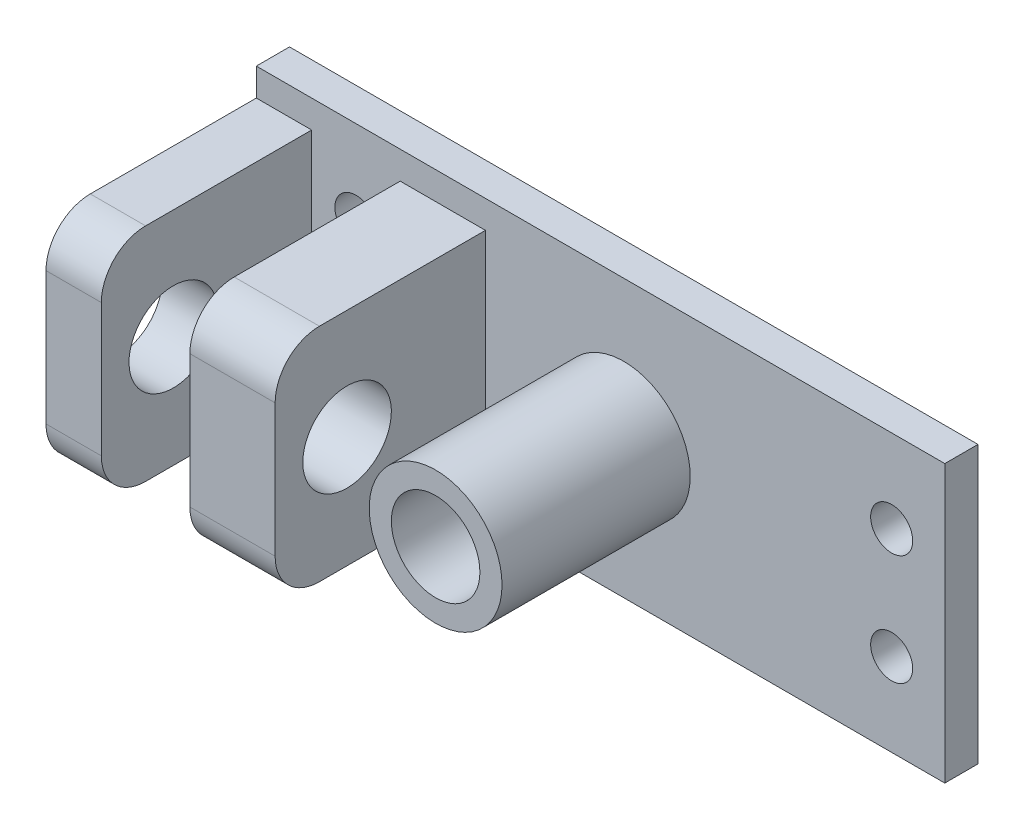
ISO-10303-21;
HEADER;
FILE_DESCRIPTION(('STEP AP214'),'2;1');
FILE_NAME('part.step','',(''),(''),'','','');
FILE_SCHEMA(('AUTOMOTIVE_DESIGN { 1 0 10303 214 1 1 1 1 }'));
ENDSEC;
DATA;
#1=APPLICATION_CONTEXT('core data for automotive mechanical design processes');
#2=APPLICATION_PROTOCOL_DEFINITION('international standard','automotive_design',2000,#1);
#3=PRODUCT_CONTEXT('',#1,'mechanical');
#4=PRODUCT('Part','Part','',(#3));
#5=PRODUCT_RELATED_PRODUCT_CATEGORY('part','',(#4));
#6=PRODUCT_DEFINITION_FORMATION('','',#4);
#7=PRODUCT_DEFINITION_CONTEXT('part definition',#1,'design');
#8=PRODUCT_DEFINITION('design','',#6,#7);
#9=PRODUCT_DEFINITION_SHAPE('','',#8);
#10=(LENGTH_UNIT() NAMED_UNIT(*) SI_UNIT(.MILLI.,.METRE.));
#11=(NAMED_UNIT(*) PLANE_ANGLE_UNIT() SI_UNIT($,.RADIAN.));
#12=(NAMED_UNIT(*) SI_UNIT($,.STERADIAN.) SOLID_ANGLE_UNIT());
#13=UNCERTAINTY_MEASURE_WITH_UNIT(LENGTH_MEASURE(1.E-05),#10,'distance_accuracy_value','');
#14=(GEOMETRIC_REPRESENTATION_CONTEXT(3) GLOBAL_UNCERTAINTY_ASSIGNED_CONTEXT((#13)) GLOBAL_UNIT_ASSIGNED_CONTEXT((#10,
#11,#12)) REPRESENTATION_CONTEXT('',''));
#15=CARTESIAN_POINT('',(0.,0.,0.));
#16=DIRECTION('',(0.,0.,1.));
#17=DIRECTION('',(1.,0.,0.));
#18=AXIS2_PLACEMENT_3D('',#15,#16,#17);
#19=CARTESIAN_POINT('',(0.,0.,3.));
#20=DIRECTION('',(0.,0.,1.));
#21=DIRECTION('',(1.,0.,0.));
#22=AXIS2_PLACEMENT_3D('',#19,#20,#21);
#23=PLANE('',#22);
#24=CARTESIAN_POINT('',(0.,0.,3.));
#25=DIRECTION('',(0.,0.,1.));
#26=DIRECTION('',(1.,0.,0.));
#27=AXIS2_PLACEMENT_3D('',#24,#25,#26);
#28=CIRCLE('',#27,6.);
#29=CARTESIAN_POINT('',(6.,0.,3.));
#30=VERTEX_POINT('',#29);
#31=EDGE_CURVE('E269',#30,#30,#28,.F.);
#32=ORIENTED_EDGE('',*,*,#31,.T.);
#33=EDGE_LOOP('',(#32));
#34=FACE_BOUND('',#33,.T.);
#35=CARTESIAN_POINT('',(-24.2,5.,3.));
#36=DIRECTION('',(0.,0.,1.));
#37=DIRECTION('',(1.,0.,0.));
#38=AXIS2_PLACEMENT_3D('',#35,#36,#37);
#39=CIRCLE('',#38,1.9);
#40=CARTESIAN_POINT('',(-22.3,5.,3.));
#41=VERTEX_POINT('',#40);
#42=EDGE_CURVE('E282',#41,#41,#39,.T.);
#43=ORIENTED_EDGE('',*,*,#42,.F.);
#44=EDGE_LOOP('',(#43));
#45=FACE_BOUND('',#44,.T.);
#46=CARTESIAN_POINT('',(24.2,5.,3.));
#47=DIRECTION('',(0.,0.,1.));
#48=DIRECTION('',(1.,0.,0.));
#49=AXIS2_PLACEMENT_3D('',#46,#47,#48);
#50=CIRCLE('',#49,1.9);
#51=CARTESIAN_POINT('',(26.1,5.,3.));
#52=VERTEX_POINT('',#51);
#53=EDGE_CURVE('E298',#52,#52,#50,.T.);
#54=ORIENTED_EDGE('',*,*,#53,.F.);
#55=EDGE_LOOP('',(#54));
#56=FACE_BOUND('',#55,.T.);
#57=CARTESIAN_POINT('',(24.2,-5.,3.));
#58=DIRECTION('',(0.,0.,1.));
#59=DIRECTION('',(1.,0.,0.));
#60=AXIS2_PLACEMENT_3D('',#57,#58,#59);
#61=CIRCLE('',#60,1.9);
#62=CARTESIAN_POINT('',(26.1,-5.,3.));
#63=VERTEX_POINT('',#62);
#64=EDGE_CURVE('E290',#63,#63,#61,.T.);
#65=ORIENTED_EDGE('',*,*,#64,.F.);
#66=EDGE_LOOP('',(#65));
#67=FACE_BOUND('',#66,.T.);
#68=CARTESIAN_POINT('',(-24.2,-5.,3.));
#69=DIRECTION('',(0.,0.,1.));
#70=DIRECTION('',(1.,0.,0.));
#71=AXIS2_PLACEMENT_3D('',#68,#69,#70);
#72=CIRCLE('',#71,1.9);
#73=CARTESIAN_POINT('',(-22.3,-5.,3.));
#74=VERTEX_POINT('',#73);
#75=EDGE_CURVE('E274',#74,#74,#72,.T.);
#76=ORIENTED_EDGE('',*,*,#75,.F.);
#77=EDGE_LOOP('',(#76));
#78=FACE_BOUND('',#77,.T.);
#79=DIRECTION('',(-1.,0.,0.));
#80=VECTOR('',#79,1.);
#81=CARTESIAN_POINT('',(-20.2,9.9981412265895,3.));
#82=LINE('',#81,#80);
#83=CARTESIAN_POINT('',(-12.5,9.9981412265895,3.));
#84=VERTEX_POINT('',#83);
#85=CARTESIAN_POINT('',(-20.2,9.9981412265895,3.));
#86=VERTEX_POINT('',#85);
#87=EDGE_CURVE('E235',#84,#86,#82,.T.);
#88=ORIENTED_EDGE('',*,*,#87,.F.);
#89=DIRECTION('',(0.,1.,0.));
#90=VECTOR('',#89,1.);
#91=CARTESIAN_POINT('',(-12.5,9.9981412265895,3.));
#92=LINE('',#91,#90);
#93=CARTESIAN_POINT('',(-12.5,-9.9981412265895,3.));
#94=VERTEX_POINT('',#93);
#95=EDGE_CURVE('E221',#94,#84,#92,.T.);
#96=ORIENTED_EDGE('',*,*,#95,.F.);
#97=DIRECTION('',(1.,0.,0.));
#98=VECTOR('',#97,1.);
#99=CARTESIAN_POINT('',(-20.2,-9.9981412265895,3.));
#100=LINE('',#99,#98);
#101=CARTESIAN_POINT('',(-20.2,-9.9981412265895,3.));
#102=VERTEX_POINT('',#101);
#103=EDGE_CURVE('E227',#102,#94,#100,.T.);
#104=ORIENTED_EDGE('',*,*,#103,.F.);
#105=DIRECTION('',(0.,-1.,0.));
#106=VECTOR('',#105,1.);
#107=CARTESIAN_POINT('',(-20.2,9.9981412265895,3.));
#108=LINE('',#107,#106);
#109=EDGE_CURVE('E239',#86,#102,#108,.T.);
#110=ORIENTED_EDGE('',*,*,#109,.F.);
#111=EDGE_LOOP('',(#88,#96,#104,#110));
#112=FACE_BOUND('',#111,.T.);
#113=DIRECTION('',(0.,-1.,0.));
#114=VECTOR('',#113,1.);
#115=CARTESIAN_POINT('',(-33.2,12.5,3.));
#116=LINE('',#115,#114);
#117=CARTESIAN_POINT('',(-33.2,12.5,3.));
#118=VERTEX_POINT('',#117);
#119=CARTESIAN_POINT('',(-33.2,9.9981412265895,3.));
#120=VERTEX_POINT('',#119);
#121=EDGE_CURVE('E176',#118,#120,#116,.T.);
#122=ORIENTED_EDGE('',*,*,#121,.T.);
#123=DIRECTION('',(-1.,0.,0.));
#124=VECTOR('',#123,1.);
#125=CARTESIAN_POINT('',(-28.2,9.9981412265895,3.));
#126=LINE('',#125,#124);
#127=CARTESIAN_POINT('',(-28.2,9.9981412265895,3.));
#128=VERTEX_POINT('',#127);
#129=EDGE_CURVE('E186',#128,#120,#126,.T.);
#130=ORIENTED_EDGE('',*,*,#129,.F.);
#131=DIRECTION('',(0.,1.,0.));
#132=VECTOR('',#131,1.);
#133=CARTESIAN_POINT('',(-28.2,9.9981412265895,3.));
#134=LINE('',#133,#132);
#135=CARTESIAN_POINT('',(-28.2,-9.9981412265895,3.));
#136=VERTEX_POINT('',#135);
#137=EDGE_CURVE('E183',#136,#128,#134,.T.);
#138=ORIENTED_EDGE('',*,*,#137,.F.);
#139=DIRECTION('',(1.,0.,0.));
#140=VECTOR('',#139,1.);
#141=CARTESIAN_POINT('',(-28.2,-9.9981412265895,3.));
#142=LINE('',#141,#140);
#143=CARTESIAN_POINT('',(-33.2,-9.9981412265895,3.));
#144=VERTEX_POINT('',#143);
#145=EDGE_CURVE('E161',#144,#136,#142,.T.);
#146=ORIENTED_EDGE('',*,*,#145,.F.);
#147=CARTESIAN_POINT('',(-33.2,-12.5,3.));
#148=VERTEX_POINT('',#147);
#149=EDGE_CURVE('E168',#144,#148,#116,.T.);
#150=ORIENTED_EDGE('',*,*,#149,.T.);
#151=DIRECTION('',(1.,0.,0.));
#152=VECTOR('',#151,1.);
#153=CARTESIAN_POINT('',(-29.,-12.5,3.));
#154=LINE('',#153,#152);
#155=CARTESIAN_POINT('',(29.,-12.5,3.));
#156=VERTEX_POINT('',#155);
#157=EDGE_CURVE('E314',#148,#156,#154,.T.);
#158=ORIENTED_EDGE('',*,*,#157,.T.);
#159=DIRECTION('',(0.,1.,0.));
#160=VECTOR('',#159,1.);
#161=CARTESIAN_POINT('',(29.,12.5,3.));
#162=LINE('',#161,#160);
#163=CARTESIAN_POINT('',(29.,12.5,3.));
#164=VERTEX_POINT('',#163);
#165=EDGE_CURVE('E306',#156,#164,#162,.T.);
#166=ORIENTED_EDGE('',*,*,#165,.T.);
#167=DIRECTION('',(-1.,0.,0.));
#168=VECTOR('',#167,1.);
#169=CARTESIAN_POINT('',(-29.,12.5,3.));
#170=LINE('',#169,#168);
#171=EDGE_CURVE('E310',#164,#118,#170,.T.);
#172=ORIENTED_EDGE('',*,*,#171,.T.);
#173=EDGE_LOOP('',(#122,#130,#138,#146,#150,#158,#166,#172));
#174=FACE_BOUND('',#173,.T.);
#175=ADVANCED_FACE('F45',(#34,#45,#56,#67,#78,#112,#174),#23,.T.);
#176=CARTESIAN_POINT('',(0.,0.,0.));
#177=DIRECTION('',(0.,0.,1.));
#178=DIRECTION('',(1.,0.,0.));
#179=AXIS2_PLACEMENT_3D('',#176,#177,#178);
#180=PLANE('',#179);
#181=CARTESIAN_POINT('',(0.,0.,0.));
#182=DIRECTION('',(0.,0.,1.));
#183=DIRECTION('',(1.,0.,0.));
#184=AXIS2_PLACEMENT_3D('',#181,#182,#183);
#185=CIRCLE('',#184,4.);
#186=CARTESIAN_POINT('',(4.,0.,0.));
#187=VERTEX_POINT('',#186);
#188=EDGE_CURVE('E258',#187,#187,#185,.T.);
#189=ORIENTED_EDGE('',*,*,#188,.T.);
#190=EDGE_LOOP('',(#189));
#191=FACE_BOUND('',#190,.T.);
#192=DIRECTION('',(0.,1.,0.));
#193=VECTOR('',#192,1.);
#194=CARTESIAN_POINT('',(29.,12.5,0.));
#195=LINE('',#194,#193);
#196=CARTESIAN_POINT('',(29.,-12.5,0.));
#197=VERTEX_POINT('',#196);
#198=CARTESIAN_POINT('',(29.,12.5,0.));
#199=VERTEX_POINT('',#198);
#200=EDGE_CURVE('E302',#197,#199,#195,.T.);
#201=ORIENTED_EDGE('',*,*,#200,.F.);
#202=DIRECTION('',(1.,0.,0.));
#203=VECTOR('',#202,1.);
#204=CARTESIAN_POINT('',(-29.,-12.5,0.));
#205=LINE('',#204,#203);
#206=CARTESIAN_POINT('',(-33.2,-12.5,0.));
#207=VERTEX_POINT('',#206);
#208=EDGE_CURVE('E311',#207,#197,#205,.T.);
#209=ORIENTED_EDGE('',*,*,#208,.F.);
#210=DIRECTION('',(0.,-1.,0.));
#211=VECTOR('',#210,1.);
#212=CARTESIAN_POINT('',(-33.2,12.5,0.));
#213=LINE('',#212,#211);
#214=CARTESIAN_POINT('',(-33.2,12.5,0.));
#215=VERTEX_POINT('',#214);
#216=EDGE_CURVE('E203',#215,#207,#213,.T.);
#217=ORIENTED_EDGE('',*,*,#216,.F.);
#218=DIRECTION('',(-1.,0.,0.));
#219=VECTOR('',#218,1.);
#220=CARTESIAN_POINT('',(-29.,12.5,0.));
#221=LINE('',#220,#219);
#222=EDGE_CURVE('E321',#199,#215,#221,.T.);
#223=ORIENTED_EDGE('',*,*,#222,.F.);
#224=EDGE_LOOP('',(#201,#209,#217,#223));
#225=FACE_BOUND('',#224,.T.);
#226=CARTESIAN_POINT('',(24.2,5.,0.));
#227=DIRECTION('',(0.,0.,1.));
#228=DIRECTION('',(1.,0.,0.));
#229=AXIS2_PLACEMENT_3D('',#226,#227,#228);
#230=CIRCLE('',#229,1.9);
#231=CARTESIAN_POINT('',(26.1,5.,0.));
#232=VERTEX_POINT('',#231);
#233=EDGE_CURVE('E294',#232,#232,#230,.T.);
#234=ORIENTED_EDGE('',*,*,#233,.T.);
#235=EDGE_LOOP('',(#234));
#236=FACE_BOUND('',#235,.T.);
#237=CARTESIAN_POINT('',(24.2,-5.,0.));
#238=DIRECTION('',(0.,0.,1.));
#239=DIRECTION('',(1.,0.,0.));
#240=AXIS2_PLACEMENT_3D('',#237,#238,#239);
#241=CIRCLE('',#240,1.9);
#242=CARTESIAN_POINT('',(26.1,-5.,0.));
#243=VERTEX_POINT('',#242);
#244=EDGE_CURVE('E286',#243,#243,#241,.T.);
#245=ORIENTED_EDGE('',*,*,#244,.T.);
#246=EDGE_LOOP('',(#245));
#247=FACE_BOUND('',#246,.T.);
#248=CARTESIAN_POINT('',(-24.2,5.,0.));
#249=DIRECTION('',(0.,0.,1.));
#250=DIRECTION('',(1.,0.,0.));
#251=AXIS2_PLACEMENT_3D('',#248,#249,#250);
#252=CIRCLE('',#251,1.9);
#253=CARTESIAN_POINT('',(-22.3,5.,0.));
#254=VERTEX_POINT('',#253);
#255=EDGE_CURVE('E278',#254,#254,#252,.T.);
#256=ORIENTED_EDGE('',*,*,#255,.T.);
#257=EDGE_LOOP('',(#256));
#258=FACE_BOUND('',#257,.T.);
#259=CARTESIAN_POINT('',(-24.2,-5.,0.));
#260=DIRECTION('',(0.,0.,1.));
#261=DIRECTION('',(1.,0.,0.));
#262=AXIS2_PLACEMENT_3D('',#259,#260,#261);
#263=CIRCLE('',#262,1.9);
#264=CARTESIAN_POINT('',(-22.3,-5.,0.));
#265=VERTEX_POINT('',#264);
#266=EDGE_CURVE('E273',#265,#265,#263,.T.);
#267=ORIENTED_EDGE('',*,*,#266,.T.);
#268=EDGE_LOOP('',(#267));
#269=FACE_BOUND('',#268,.T.);
#270=ADVANCED_FACE('F423',(#191,#225,#236,#247,#258,#269),#180,.F.);
#271=CARTESIAN_POINT('',(29.,12.5,3.));
#272=DIRECTION('',(-1.,0.,0.));
#273=DIRECTION('',(0.,0.,1.));
#274=AXIS2_PLACEMENT_3D('',#271,#272,#273);
#275=PLANE('',#274);
#276=ORIENTED_EDGE('',*,*,#200,.T.);
#277=DIRECTION('',(0.,0.,-1.));
#278=VECTOR('',#277,1.);
#279=CARTESIAN_POINT('',(29.,12.5,3.));
#280=LINE('',#279,#278);
#281=EDGE_CURVE('E329',#164,#199,#280,.T.);
#282=ORIENTED_EDGE('',*,*,#281,.F.);
#283=ORIENTED_EDGE('',*,*,#165,.F.);
#284=DIRECTION('',(0.,0.,-1.));
#285=VECTOR('',#284,1.);
#286=CARTESIAN_POINT('',(29.,-12.5,3.));
#287=LINE('',#286,#285);
#288=EDGE_CURVE('E317',#156,#197,#287,.T.);
#289=ORIENTED_EDGE('',*,*,#288,.T.);
#290=EDGE_LOOP('',(#276,#282,#283,#289));
#291=FACE_BOUND('',#290,.T.);
#292=ADVANCED_FACE('F430',(#291),#275,.F.);
#293=CARTESIAN_POINT('',(-29.,12.5,3.));
#294=DIRECTION('',(0.,-1.,0.));
#295=DIRECTION('',(0.,0.,-1.));
#296=AXIS2_PLACEMENT_3D('',#293,#294,#295);
#297=PLANE('',#296);
#298=ORIENTED_EDGE('',*,*,#222,.T.);
#299=DIRECTION('',(0.,0.,1.));
#300=VECTOR('',#299,1.);
#301=CARTESIAN_POINT('',(-33.2,12.5,0.));
#302=LINE('',#301,#300);
#303=EDGE_CURVE('E205',#215,#118,#302,.T.);
#304=ORIENTED_EDGE('',*,*,#303,.T.);
#305=ORIENTED_EDGE('',*,*,#171,.F.);
#306=ORIENTED_EDGE('',*,*,#281,.T.);
#307=EDGE_LOOP('',(#298,#304,#305,#306));
#308=FACE_BOUND('',#307,.T.);
#309=ADVANCED_FACE('F440',(#308),#297,.F.);
#310=CARTESIAN_POINT('',(-29.,-12.5,3.));
#311=DIRECTION('',(0.,1.,0.));
#312=DIRECTION('',(0.,0.,1.));
#313=AXIS2_PLACEMENT_3D('',#310,#311,#312);
#314=PLANE('',#313);
#315=ORIENTED_EDGE('',*,*,#208,.T.);
#316=ORIENTED_EDGE('',*,*,#288,.F.);
#317=ORIENTED_EDGE('',*,*,#157,.F.);
#318=DIRECTION('',(0.,0.,1.));
#319=VECTOR('',#318,1.);
#320=CARTESIAN_POINT('',(-33.2,-12.5,0.));
#321=LINE('',#320,#319);
#322=EDGE_CURVE('E172',#207,#148,#321,.T.);
#323=ORIENTED_EDGE('',*,*,#322,.F.);
#324=EDGE_LOOP('',(#315,#316,#317,#323));
#325=FACE_BOUND('',#324,.T.);
#326=ADVANCED_FACE('F438',(#325),#314,.F.);
#327=CARTESIAN_POINT('',(24.2,5.,3.));
#328=DIRECTION('',(0.,0.,-1.));
#329=DIRECTION('',(-1.,0.,0.));
#330=AXIS2_PLACEMENT_3D('',#327,#328,#329);
#331=CYLINDRICAL_SURFACE('',#330,1.9);
#332=ORIENTED_EDGE('',*,*,#53,.T.);
#333=EDGE_LOOP('',(#332));
#334=FACE_BOUND('',#333,.T.);
#335=ORIENTED_EDGE('',*,*,#233,.F.);
#336=EDGE_LOOP('',(#335));
#337=FACE_BOUND('',#336,.T.);
#338=ADVANCED_FACE('F435',(#334,#337),#331,.F.);
#339=CARTESIAN_POINT('',(24.2,-5.,3.));
#340=DIRECTION('',(0.,0.,-1.));
#341=DIRECTION('',(-1.,0.,0.));
#342=AXIS2_PLACEMENT_3D('',#339,#340,#341);
#343=CYLINDRICAL_SURFACE('',#342,1.9);
#344=ORIENTED_EDGE('',*,*,#64,.T.);
#345=EDGE_LOOP('',(#344));
#346=FACE_BOUND('',#345,.T.);
#347=ORIENTED_EDGE('',*,*,#244,.F.);
#348=EDGE_LOOP('',(#347));
#349=FACE_BOUND('',#348,.T.);
#350=ADVANCED_FACE('F624',(#346,#349),#343,.F.);
#351=CARTESIAN_POINT('',(-24.2,5.,3.));
#352=DIRECTION('',(0.,0.,-1.));
#353=DIRECTION('',(-1.,0.,0.));
#354=AXIS2_PLACEMENT_3D('',#351,#352,#353);
#355=CYLINDRICAL_SURFACE('',#354,1.9);
#356=ORIENTED_EDGE('',*,*,#42,.T.);
#357=EDGE_LOOP('',(#356));
#358=FACE_BOUND('',#357,.T.);
#359=ORIENTED_EDGE('',*,*,#255,.F.);
#360=EDGE_LOOP('',(#359));
#361=FACE_BOUND('',#360,.T.);
#362=ADVANCED_FACE('F615',(#358,#361),#355,.F.);
#363=CARTESIAN_POINT('',(-24.2,-5.,3.));
#364=DIRECTION('',(0.,0.,-1.));
#365=DIRECTION('',(-1.,0.,0.));
#366=AXIS2_PLACEMENT_3D('',#363,#364,#365);
#367=CYLINDRICAL_SURFACE('',#366,1.9);
#368=ORIENTED_EDGE('',*,*,#75,.T.);
#369=EDGE_LOOP('',(#368));
#370=FACE_BOUND('',#369,.T.);
#371=ORIENTED_EDGE('',*,*,#266,.F.);
#372=EDGE_LOOP('',(#371));
#373=FACE_BOUND('',#372,.T.);
#374=ADVANCED_FACE('F606',(#370,#373),#367,.F.);
#375=CARTESIAN_POINT('',(0.,0.,20.));
#376=DIRECTION('',(0.,0.,-1.));
#377=DIRECTION('',(-1.,0.,0.));
#378=AXIS2_PLACEMENT_3D('',#375,#376,#377);
#379=CYLINDRICAL_SURFACE('',#378,6.);
#380=ORIENTED_EDGE('',*,*,#31,.F.);
#381=EDGE_LOOP('',(#380));
#382=FACE_BOUND('',#381,.T.);
#383=CARTESIAN_POINT('',(0.,0.,20.));
#384=DIRECTION('',(0.,0.,1.));
#385=DIRECTION('',(1.,0.,0.));
#386=AXIS2_PLACEMENT_3D('',#383,#384,#385);
#387=CIRCLE('',#386,6.);
#388=CARTESIAN_POINT('',(6.,0.,20.));
#389=VERTEX_POINT('',#388);
#390=EDGE_CURVE('E262',#389,#389,#387,.T.);
#391=ORIENTED_EDGE('',*,*,#390,.F.);
#392=EDGE_LOOP('',(#391));
#393=FACE_BOUND('',#392,.T.);
#394=ADVANCED_FACE('F597',(#382,#393),#379,.T.);
#395=CARTESIAN_POINT('',(0.,0.,20.));
#396=DIRECTION('',(0.,0.,1.));
#397=DIRECTION('',(1.,0.,0.));
#398=AXIS2_PLACEMENT_3D('',#395,#396,#397);
#399=PLANE('',#398);
#400=CARTESIAN_POINT('',(0.,0.,20.));
#401=DIRECTION('',(0.,0.,1.));
#402=DIRECTION('',(1.,0.,0.));
#403=AXIS2_PLACEMENT_3D('',#400,#401,#402);
#404=CIRCLE('',#403,4.);
#405=CARTESIAN_POINT('',(4.,0.,20.));
#406=VERTEX_POINT('',#405);
#407=EDGE_CURVE('E257',#406,#406,#404,.T.);
#408=ORIENTED_EDGE('',*,*,#407,.F.);
#409=EDGE_LOOP('',(#408));
#410=FACE_BOUND('',#409,.T.);
#411=ORIENTED_EDGE('',*,*,#390,.T.);
#412=EDGE_LOOP('',(#411));
#413=FACE_BOUND('',#412,.T.);
#414=ADVANCED_FACE('F588',(#410,#413),#399,.T.);
#415=CARTESIAN_POINT('',(0.,0.,0.));
#416=DIRECTION('',(0.,0.,1.));
#417=DIRECTION('',(1.,0.,0.));
#418=AXIS2_PLACEMENT_3D('',#415,#416,#417);
#419=CYLINDRICAL_SURFACE('',#418,4.);
#420=ORIENTED_EDGE('',*,*,#188,.F.);
#421=EDGE_LOOP('',(#420));
#422=FACE_BOUND('',#421,.T.);
#423=ORIENTED_EDGE('',*,*,#407,.T.);
#424=EDGE_LOOP('',(#423));
#425=FACE_BOUND('',#424,.T.);
#426=ADVANCED_FACE('F579',(#422,#425),#419,.F.);
#427=CARTESIAN_POINT('',(-12.5,9.9981412265895,22.));
#428=DIRECTION('',(-1.,0.,0.));
#429=DIRECTION('',(0.,-1.,0.));
#430=AXIS2_PLACEMENT_3D('',#427,#428,#429);
#431=PLANE('',#430);
#432=CARTESIAN_POINT('',(-12.5,0.0808269052919655,15.5));
#433=DIRECTION('',(-1.,0.,0.));
#434=DIRECTION('',(0.,-1.,0.));
#435=AXIS2_PLACEMENT_3D('',#432,#433,#434);
#436=CIRCLE('',#435,4.);
#437=CARTESIAN_POINT('',(-12.5,-3.91917309470803,15.5));
#438=VERTEX_POINT('',#437);
#439=EDGE_CURVE('E210',#438,#438,#436,.F.);
#440=ORIENTED_EDGE('',*,*,#439,.F.);
#441=EDGE_LOOP('',(#440));
#442=FACE_BOUND('',#441,.T.);
#443=DIRECTION('',(0.,1.,0.));
#444=VECTOR('',#443,1.);
#445=CARTESIAN_POINT('',(-12.5,9.9981412265895,22.));
#446=LINE('',#445,#444);
#447=CARTESIAN_POINT('',(-12.5,-5.9981412265895,22.));
#448=VERTEX_POINT('',#447);
#449=CARTESIAN_POINT('',(-12.5,5.9981412265895,22.));
#450=VERTEX_POINT('',#449);
#451=EDGE_CURVE('E222',#448,#450,#446,.T.);
#452=ORIENTED_EDGE('',*,*,#451,.F.);
#453=CARTESIAN_POINT('',(-12.5,-5.9981412265895,18.));
#454=DIRECTION('',(-1.,0.,0.));
#455=DIRECTION('',(0.,-1.,0.));
#456=AXIS2_PLACEMENT_3D('',#453,#454,#455);
#457=CIRCLE('',#456,4.);
#458=CARTESIAN_POINT('',(-12.5,-9.9981412265895,18.));
#459=VERTEX_POINT('',#458);
#460=EDGE_CURVE('E344',#448,#459,#457,.F.);
#461=ORIENTED_EDGE('',*,*,#460,.T.);
#462=DIRECTION('',(0.,0.,-1.));
#463=VECTOR('',#462,1.);
#464=CARTESIAN_POINT('',(-12.5,-9.9981412265895,22.));
#465=LINE('',#464,#463);
#466=EDGE_CURVE('E231',#459,#94,#465,.T.);
#467=ORIENTED_EDGE('',*,*,#466,.T.);
#468=ORIENTED_EDGE('',*,*,#95,.T.);
#469=DIRECTION('',(0.,0.,-1.));
#470=VECTOR('',#469,1.);
#471=CARTESIAN_POINT('',(-12.5,9.9981412265895,22.));
#472=LINE('',#471,#470);
#473=CARTESIAN_POINT('',(-12.5,9.9981412265895,18.));
#474=VERTEX_POINT('',#473);
#475=EDGE_CURVE('E254',#474,#84,#472,.T.);
#476=ORIENTED_EDGE('',*,*,#475,.F.);
#477=CARTESIAN_POINT('',(-12.5,5.9981412265895,18.));
#478=DIRECTION('',(-1.,0.,0.));
#479=DIRECTION('',(0.,-1.,0.));
#480=AXIS2_PLACEMENT_3D('',#477,#478,#479);
#481=CIRCLE('',#480,4.);
#482=EDGE_CURVE('E341',#474,#450,#481,.F.);
#483=ORIENTED_EDGE('',*,*,#482,.T.);
#484=EDGE_LOOP('',(#452,#461,#467,#468,#476,#483));
#485=FACE_BOUND('',#484,.T.);
#486=ADVANCED_FACE('F570',(#442,#485),#431,.F.);
#487=CARTESIAN_POINT('',(-20.2,9.9981412265895,22.));
#488=DIRECTION('',(0.,-1.,0.));
#489=DIRECTION('',(0.,0.,-1.));
#490=AXIS2_PLACEMENT_3D('',#487,#488,#489);
#491=PLANE('',#490);
#492=DIRECTION('',(0.,0.,-1.));
#493=VECTOR('',#492,1.);
#494=CARTESIAN_POINT('',(-20.2,9.9981412265895,22.));
#495=LINE('',#494,#493);
#496=CARTESIAN_POINT('',(-20.2,9.9981412265895,18.));
#497=VERTEX_POINT('',#496);
#498=EDGE_CURVE('E251',#497,#86,#495,.T.);
#499=ORIENTED_EDGE('',*,*,#498,.F.);
#500=DIRECTION('',(-1.,0.,0.));
#501=VECTOR('',#500,1.);
#502=CARTESIAN_POINT('',(-12.5,9.9981412265895,18.));
#503=LINE('',#502,#501);
#504=EDGE_CURVE('E356',#497,#474,#503,.F.);
#505=ORIENTED_EDGE('',*,*,#504,.T.);
#506=ORIENTED_EDGE('',*,*,#475,.T.);
#507=ORIENTED_EDGE('',*,*,#87,.T.);
#508=EDGE_LOOP('',(#499,#505,#506,#507));
#509=FACE_BOUND('',#508,.T.);
#510=ADVANCED_FACE('F561',(#509),#491,.F.);
#511=CARTESIAN_POINT('',(-20.2,9.9981412265895,22.));
#512=DIRECTION('',(1.,0.,0.));
#513=DIRECTION('',(0.,0.,-1.));
#514=AXIS2_PLACEMENT_3D('',#511,#512,#513);
#515=PLANE('',#514);
#516=CARTESIAN_POINT('',(-20.2,0.0808269052919655,15.5));
#517=DIRECTION('',(-1.,0.,0.));
#518=DIRECTION('',(0.,0.,1.));
#519=AXIS2_PLACEMENT_3D('',#516,#517,#518);
#520=CIRCLE('',#519,4.);
#521=CARTESIAN_POINT('',(-20.2,0.0808269052919655,19.5));
#522=VERTEX_POINT('',#521);
#523=EDGE_CURVE('E217',#522,#522,#520,.T.);
#524=ORIENTED_EDGE('',*,*,#523,.F.);
#525=EDGE_LOOP('',(#524));
#526=FACE_BOUND('',#525,.T.);
#527=DIRECTION('',(0.,0.,-1.));
#528=VECTOR('',#527,1.);
#529=CARTESIAN_POINT('',(-20.2,-9.9981412265895,22.));
#530=LINE('',#529,#528);
#531=CARTESIAN_POINT('',(-20.2,-9.9981412265895,18.));
#532=VERTEX_POINT('',#531);
#533=EDGE_CURVE('E248',#532,#102,#530,.T.);
#534=ORIENTED_EDGE('',*,*,#533,.F.);
#535=CARTESIAN_POINT('',(-20.2,-5.9981412265895,18.));
#536=DIRECTION('',(1.,0.,0.));
#537=DIRECTION('',(0.,0.,-1.));
#538=AXIS2_PLACEMENT_3D('',#535,#536,#537);
#539=CIRCLE('',#538,4.);
#540=CARTESIAN_POINT('',(-20.2,-5.9981412265895,22.));
#541=VERTEX_POINT('',#540);
#542=EDGE_CURVE('E353',#532,#541,#539,.F.);
#543=ORIENTED_EDGE('',*,*,#542,.T.);
#544=DIRECTION('',(0.,-1.,0.));
#545=VECTOR('',#544,1.);
#546=CARTESIAN_POINT('',(-20.2,9.9981412265895,22.));
#547=LINE('',#546,#545);
#548=CARTESIAN_POINT('',(-20.2,5.9981412265895,22.));
#549=VERTEX_POINT('',#548);
#550=EDGE_CURVE('E226',#549,#541,#547,.T.);
#551=ORIENTED_EDGE('',*,*,#550,.F.);
#552=CARTESIAN_POINT('',(-20.2,5.9981412265895,18.));
#553=DIRECTION('',(1.,0.,0.));
#554=DIRECTION('',(0.,0.,-1.));
#555=AXIS2_PLACEMENT_3D('',#552,#553,#554);
#556=CIRCLE('',#555,4.);
#557=EDGE_CURVE('E350',#549,#497,#556,.F.);
#558=ORIENTED_EDGE('',*,*,#557,.T.);
#559=ORIENTED_EDGE('',*,*,#498,.T.);
#560=ORIENTED_EDGE('',*,*,#109,.T.);
#561=EDGE_LOOP('',(#534,#543,#551,#558,#559,#560));
#562=FACE_BOUND('',#561,.T.);
#563=ADVANCED_FACE('F552',(#526,#562),#515,.F.);
#564=CARTESIAN_POINT('',(-20.2,-9.9981412265895,22.));
#565=DIRECTION('',(0.,1.,0.));
#566=DIRECTION('',(0.,0.,1.));
#567=AXIS2_PLACEMENT_3D('',#564,#565,#566);
#568=PLANE('',#567);
#569=ORIENTED_EDGE('',*,*,#466,.F.);
#570=DIRECTION('',(1.,0.,0.));
#571=VECTOR('',#570,1.);
#572=CARTESIAN_POINT('',(-20.2,-9.9981412265895,18.));
#573=LINE('',#572,#571);
#574=EDGE_CURVE('E347',#459,#532,#573,.F.);
#575=ORIENTED_EDGE('',*,*,#574,.T.);
#576=ORIENTED_EDGE('',*,*,#533,.T.);
#577=ORIENTED_EDGE('',*,*,#103,.T.);
#578=EDGE_LOOP('',(#569,#575,#576,#577));
#579=FACE_BOUND('',#578,.T.);
#580=ADVANCED_FACE('F543',(#579),#568,.F.);
#581=CARTESIAN_POINT('',(0.,0.,22.));
#582=DIRECTION('',(0.,0.,1.));
#583=DIRECTION('',(1.,0.,0.));
#584=AXIS2_PLACEMENT_3D('',#581,#582,#583);
#585=PLANE('',#584);
#586=ORIENTED_EDGE('',*,*,#550,.T.);
#587=DIRECTION('',(1.,0.,0.));
#588=VECTOR('',#587,1.);
#589=CARTESIAN_POINT('',(-12.5,-5.9981412265895,22.));
#590=LINE('',#589,#588);
#591=EDGE_CURVE('E337',#541,#448,#590,.T.);
#592=ORIENTED_EDGE('',*,*,#591,.T.);
#593=ORIENTED_EDGE('',*,*,#451,.T.);
#594=DIRECTION('',(-1.,0.,0.));
#595=VECTOR('',#594,1.);
#596=CARTESIAN_POINT('',(-20.2,5.9981412265895,22.));
#597=LINE('',#596,#595);
#598=EDGE_CURVE('E333',#450,#549,#597,.T.);
#599=ORIENTED_EDGE('',*,*,#598,.T.);
#600=EDGE_LOOP('',(#586,#592,#593,#599));
#601=FACE_BOUND('',#600,.T.);
#602=ADVANCED_FACE('F534',(#601),#585,.T.);
#603=CARTESIAN_POINT('',(29.001,0.0808269052919655,15.5));
#604=DIRECTION('',(-1.,0.,0.));
#605=DIRECTION('',(0.,0.,1.));
#606=AXIS2_PLACEMENT_3D('',#603,#604,#605);
#607=CYLINDRICAL_SURFACE('',#606,4.);
#608=ORIENTED_EDGE('',*,*,#523,.T.);
#609=EDGE_LOOP('',(#608));
#610=FACE_BOUND('',#609,.T.);
#611=ORIENTED_EDGE('',*,*,#439,.T.);
#612=EDGE_LOOP('',(#611));
#613=FACE_BOUND('',#612,.T.);
#614=ADVANCED_FACE('F451',(#610,#613),#607,.F.);
#615=CARTESIAN_POINT('',(0.,-5.9981412265895,18.));
#616=DIRECTION('',(-1.,0.,0.));
#617=DIRECTION('',(0.,0.,1.));
#618=AXIS2_PLACEMENT_3D('',#615,#616,#617);
#619=CYLINDRICAL_SURFACE('',#618,4.);
#620=ORIENTED_EDGE('',*,*,#542,.F.);
#621=ORIENTED_EDGE('',*,*,#574,.F.);
#622=ORIENTED_EDGE('',*,*,#460,.F.);
#623=ORIENTED_EDGE('',*,*,#591,.F.);
#624=EDGE_LOOP('',(#620,#621,#622,#623));
#625=FACE_BOUND('',#624,.T.);
#626=ADVANCED_FACE('F448',(#625),#619,.T.);
#627=CARTESIAN_POINT('',(0.,5.9981412265895,18.));
#628=DIRECTION('',(1.,0.,0.));
#629=DIRECTION('',(0.,0.,-1.));
#630=AXIS2_PLACEMENT_3D('',#627,#628,#629);
#631=CYLINDRICAL_SURFACE('',#630,4.);
#632=ORIENTED_EDGE('',*,*,#482,.F.);
#633=ORIENTED_EDGE('',*,*,#504,.F.);
#634=ORIENTED_EDGE('',*,*,#557,.F.);
#635=ORIENTED_EDGE('',*,*,#598,.F.);
#636=EDGE_LOOP('',(#632,#633,#634,#635));
#637=FACE_BOUND('',#636,.T.);
#638=ADVANCED_FACE('F420',(#637),#631,.T.);
#639=CARTESIAN_POINT('',(-33.2,12.5,0.));
#640=DIRECTION('',(-1.,0.,0.));
#641=DIRECTION('',(0.,-1.,0.));
#642=AXIS2_PLACEMENT_3D('',#639,#640,#641);
#643=PLANE('',#642);
#644=CARTESIAN_POINT('',(-33.2,0.0635780718363604,15.5));
#645=DIRECTION('',(-1.,0.,0.));
#646=DIRECTION('',(0.,-1.,0.));
#647=AXIS2_PLACEMENT_3D('',#644,#645,#646);
#648=CIRCLE('',#647,4.);
#649=CARTESIAN_POINT('',(-33.2,-3.93642192816364,15.5));
#650=VERTEX_POINT('',#649);
#651=EDGE_CURVE('E399',#650,#650,#648,.F.);
#652=ORIENTED_EDGE('',*,*,#651,.T.);
#653=EDGE_LOOP('',(#652));
#654=FACE_BOUND('',#653,.T.);
#655=DIRECTION('',(0.,0.,-1.));
#656=VECTOR('',#655,1.);
#657=CARTESIAN_POINT('',(-33.2,-9.9981412265895,22.));
#658=LINE('',#657,#656);
#659=CARTESIAN_POINT('',(-33.2,-9.9981412265895,18.));
#660=VERTEX_POINT('',#659);
#661=EDGE_CURVE('E157',#660,#144,#658,.T.);
#662=ORIENTED_EDGE('',*,*,#661,.F.);
#663=CARTESIAN_POINT('',(-33.2,-5.9981412265895,18.));
#664=DIRECTION('',(-1.,0.,0.));
#665=DIRECTION('',(0.,-1.,0.));
#666=AXIS2_PLACEMENT_3D('',#663,#664,#665);
#667=CIRCLE('',#666,4.);
#668=CARTESIAN_POINT('',(-33.2,-5.9981412265895,22.));
#669=VERTEX_POINT('',#668);
#670=EDGE_CURVE('E54',#660,#669,#667,.T.);
#671=ORIENTED_EDGE('',*,*,#670,.T.);
#672=DIRECTION('',(0.,-1.,0.));
#673=VECTOR('',#672,1.);
#674=CARTESIAN_POINT('',(-33.2,9.9981412265895,22.));
#675=LINE('',#674,#673);
#676=CARTESIAN_POINT('',(-33.2,5.9981412265895,22.));
#677=VERTEX_POINT('',#676);
#678=EDGE_CURVE('E191',#677,#669,#675,.T.);
#679=ORIENTED_EDGE('',*,*,#678,.F.);
#680=CARTESIAN_POINT('',(-33.2,5.9981412265895,18.));
#681=DIRECTION('',(-1.,0.,0.));
#682=DIRECTION('',(0.,-1.,0.));
#683=AXIS2_PLACEMENT_3D('',#680,#681,#682);
#684=CIRCLE('',#683,4.);
#685=CARTESIAN_POINT('',(-33.2,9.9981412265895,18.));
#686=VERTEX_POINT('',#685);
#687=EDGE_CURVE('E61',#677,#686,#684,.T.);
#688=ORIENTED_EDGE('',*,*,#687,.T.);
#689=DIRECTION('',(0.,0.,-1.));
#690=VECTOR('',#689,1.);
#691=CARTESIAN_POINT('',(-33.2,9.9981412265895,22.));
#692=LINE('',#691,#690);
#693=EDGE_CURVE('E164',#686,#120,#692,.T.);
#694=ORIENTED_EDGE('',*,*,#693,.T.);
#695=ORIENTED_EDGE('',*,*,#121,.F.);
#696=ORIENTED_EDGE('',*,*,#303,.F.);
#697=ORIENTED_EDGE('',*,*,#216,.T.);
#698=ORIENTED_EDGE('',*,*,#322,.T.);
#699=ORIENTED_EDGE('',*,*,#149,.F.);
#700=EDGE_LOOP('',(#662,#671,#679,#688,#694,#695,#696,#697,#698,#699));
#701=FACE_BOUND('',#700,.T.);
#702=ADVANCED_FACE('F169',(#654,#701),#643,.T.);
#703=CARTESIAN_POINT('',(-28.2,9.9981412265895,22.));
#704=DIRECTION('',(-1.,0.,0.));
#705=DIRECTION('',(0.,-1.,0.));
#706=AXIS2_PLACEMENT_3D('',#703,#704,#705);
#707=PLANE('',#706);
#708=CARTESIAN_POINT('',(-28.2,0.0635780718363613,15.5));
#709=DIRECTION('',(1.,0.,0.));
#710=DIRECTION('',(0.,1.,0.));
#711=AXIS2_PLACEMENT_3D('',#708,#709,#710);
#712=CIRCLE('',#711,4.);
#713=CARTESIAN_POINT('',(-28.2,4.06357807183636,15.5));
#714=VERTEX_POINT('',#713);
#715=EDGE_CURVE('E396',#714,#714,#712,.T.);
#716=ORIENTED_EDGE('',*,*,#715,.F.);
#717=EDGE_LOOP('',(#716));
#718=FACE_BOUND('',#717,.T.);
#719=DIRECTION('',(0.,1.,0.));
#720=VECTOR('',#719,1.);
#721=CARTESIAN_POINT('',(-28.2,9.9981412265895,22.));
#722=LINE('',#721,#720);
#723=CARTESIAN_POINT('',(-28.2,-5.9981412265895,22.));
#724=VERTEX_POINT('',#723);
#725=CARTESIAN_POINT('',(-28.2,5.9981412265895,22.));
#726=VERTEX_POINT('',#725);
#727=EDGE_CURVE('E185',#724,#726,#722,.T.);
#728=ORIENTED_EDGE('',*,*,#727,.F.);
#729=CARTESIAN_POINT('',(-28.2,-5.9981412265895,18.));
#730=DIRECTION('',(-1.,0.,0.));
#731=DIRECTION('',(0.,-1.,0.));
#732=AXIS2_PLACEMENT_3D('',#729,#730,#731);
#733=CIRCLE('',#732,4.);
#734=CARTESIAN_POINT('',(-28.2,-9.9981412265895,18.));
#735=VERTEX_POINT('',#734);
#736=EDGE_CURVE('E370',#724,#735,#733,.F.);
#737=ORIENTED_EDGE('',*,*,#736,.T.);
#738=DIRECTION('',(0.,0.,-1.));
#739=VECTOR('',#738,1.);
#740=CARTESIAN_POINT('',(-28.2,-9.9981412265895,22.));
#741=LINE('',#740,#739);
#742=EDGE_CURVE('E165',#735,#136,#741,.T.);
#743=ORIENTED_EDGE('',*,*,#742,.T.);
#744=ORIENTED_EDGE('',*,*,#137,.T.);
#745=DIRECTION('',(0.,0.,-1.));
#746=VECTOR('',#745,1.);
#747=CARTESIAN_POINT('',(-28.2,9.9981412265895,22.));
#748=LINE('',#747,#746);
#749=CARTESIAN_POINT('',(-28.2,9.9981412265895,18.));
#750=VERTEX_POINT('',#749);
#751=EDGE_CURVE('E177',#750,#128,#748,.T.);
#752=ORIENTED_EDGE('',*,*,#751,.F.);
#753=CARTESIAN_POINT('',(-28.2,5.9981412265895,18.));
#754=DIRECTION('',(-1.,0.,0.));
#755=DIRECTION('',(0.,-1.,0.));
#756=AXIS2_PLACEMENT_3D('',#753,#754,#755);
#757=CIRCLE('',#756,4.);
#758=EDGE_CURVE('E367',#750,#726,#757,.F.);
#759=ORIENTED_EDGE('',*,*,#758,.T.);
#760=EDGE_LOOP('',(#728,#737,#743,#744,#752,#759));
#761=FACE_BOUND('',#760,.T.);
#762=ADVANCED_FACE('F388',(#718,#761),#707,.F.);
#763=CARTESIAN_POINT('',(-28.2,9.9981412265895,22.));
#764=DIRECTION('',(0.,-1.,0.));
#765=DIRECTION('',(0.,0.,-1.));
#766=AXIS2_PLACEMENT_3D('',#763,#764,#765);
#767=PLANE('',#766);
#768=ORIENTED_EDGE('',*,*,#693,.F.);
#769=DIRECTION('',(-1.,0.,0.));
#770=VECTOR('',#769,1.);
#771=CARTESIAN_POINT('',(-28.2,9.9981412265895,18.));
#772=LINE('',#771,#770);
#773=EDGE_CURVE('E11',#686,#750,#772,.F.);
#774=ORIENTED_EDGE('',*,*,#773,.T.);
#775=ORIENTED_EDGE('',*,*,#751,.T.);
#776=ORIENTED_EDGE('',*,*,#129,.T.);
#777=EDGE_LOOP('',(#768,#774,#775,#776));
#778=FACE_BOUND('',#777,.T.);
#779=ADVANCED_FACE('F394',(#778),#767,.F.);
#780=CARTESIAN_POINT('',(-28.2,-9.9981412265895,22.));
#781=DIRECTION('',(0.,1.,0.));
#782=DIRECTION('',(0.,0.,1.));
#783=AXIS2_PLACEMENT_3D('',#780,#781,#782);
#784=PLANE('',#783);
#785=ORIENTED_EDGE('',*,*,#742,.F.);
#786=DIRECTION('',(1.,0.,0.));
#787=VECTOR('',#786,1.);
#788=CARTESIAN_POINT('',(-28.2,-9.9981412265895,18.));
#789=LINE('',#788,#787);
#790=EDGE_CURVE('E69',#735,#660,#789,.F.);
#791=ORIENTED_EDGE('',*,*,#790,.T.);
#792=ORIENTED_EDGE('',*,*,#661,.T.);
#793=ORIENTED_EDGE('',*,*,#145,.T.);
#794=EDGE_LOOP('',(#785,#791,#792,#793));
#795=FACE_BOUND('',#794,.T.);
#796=ADVANCED_FACE('F159',(#795),#784,.F.);
#797=CARTESIAN_POINT('',(0.,0.,22.));
#798=DIRECTION('',(0.,0.,-1.));
#799=DIRECTION('',(-1.,0.,0.));
#800=AXIS2_PLACEMENT_3D('',#797,#798,#799);
#801=PLANE('',#800);
#802=ORIENTED_EDGE('',*,*,#678,.T.);
#803=DIRECTION('',(1.,0.,0.));
#804=VECTOR('',#803,1.);
#805=CARTESIAN_POINT('',(0.,-5.9981412265895,22.));
#806=LINE('',#805,#804);
#807=EDGE_CURVE('E363',#669,#724,#806,.T.);
#808=ORIENTED_EDGE('',*,*,#807,.T.);
#809=ORIENTED_EDGE('',*,*,#727,.T.);
#810=DIRECTION('',(-1.,0.,0.));
#811=VECTOR('',#810,1.);
#812=CARTESIAN_POINT('',(0.,5.9981412265895,22.));
#813=LINE('',#812,#811);
#814=EDGE_CURVE('E359',#726,#677,#813,.T.);
#815=ORIENTED_EDGE('',*,*,#814,.T.);
#816=EDGE_LOOP('',(#802,#808,#809,#815));
#817=FACE_BOUND('',#816,.T.);
#818=ADVANCED_FACE('F381',(#817),#801,.F.);
#819=CARTESIAN_POINT('',(-33.201,0.0635780718363604,15.5));
#820=DIRECTION('',(1.,0.,0.));
#821=DIRECTION('',(0.,1.,0.));
#822=AXIS2_PLACEMENT_3D('',#819,#820,#821);
#823=CYLINDRICAL_SURFACE('',#822,4.);
#824=ORIENTED_EDGE('',*,*,#651,.F.);
#825=EDGE_LOOP('',(#824));
#826=FACE_BOUND('',#825,.T.);
#827=ORIENTED_EDGE('',*,*,#715,.T.);
#828=EDGE_LOOP('',(#827));
#829=FACE_BOUND('',#828,.T.);
#830=ADVANCED_FACE('F407',(#826,#829),#823,.F.);
#831=CARTESIAN_POINT('',(0.,-5.9981412265895,18.));
#832=DIRECTION('',(1.,0.,0.));
#833=DIRECTION('',(0.,0.,-1.));
#834=AXIS2_PLACEMENT_3D('',#831,#832,#833);
#835=CYLINDRICAL_SURFACE('',#834,4.);
#836=ORIENTED_EDGE('',*,*,#670,.F.);
#837=ORIENTED_EDGE('',*,*,#790,.F.);
#838=ORIENTED_EDGE('',*,*,#736,.F.);
#839=ORIENTED_EDGE('',*,*,#807,.F.);
#840=EDGE_LOOP('',(#836,#837,#838,#839));
#841=FACE_BOUND('',#840,.T.);
#842=ADVANCED_FACE('F386',(#841),#835,.T.);
#843=CARTESIAN_POINT('',(0.,5.9981412265895,18.));
#844=DIRECTION('',(-1.,0.,0.));
#845=DIRECTION('',(0.,0.,1.));
#846=AXIS2_PLACEMENT_3D('',#843,#844,#845);
#847=CYLINDRICAL_SURFACE('',#846,4.);
#848=ORIENTED_EDGE('',*,*,#758,.F.);
#849=ORIENTED_EDGE('',*,*,#773,.F.);
#850=ORIENTED_EDGE('',*,*,#687,.F.);
#851=ORIENTED_EDGE('',*,*,#814,.F.);
#852=EDGE_LOOP('',(#848,#849,#850,#851));
#853=FACE_BOUND('',#852,.T.);
#854=ADVANCED_FACE('F47',(#853),#847,.T.);
#855=CLOSED_SHELL('',(#175,#270,#292,#309,#326,#338,#350,#362,#374,#394,#414,#426,#486,#510,
#563,#580,#602,#614,#626,#638,#702,#762,#779,#796,#818,#830,#842,#854));
#856=MANIFOLD_SOLID_BREP('B2',#855);
#857=ADVANCED_BREP_SHAPE_REPRESENTATION('',(#18,#856),#14);
#858=SHAPE_DEFINITION_REPRESENTATION(#9,#857);
ENDSEC;
END-ISO-10303-21;
